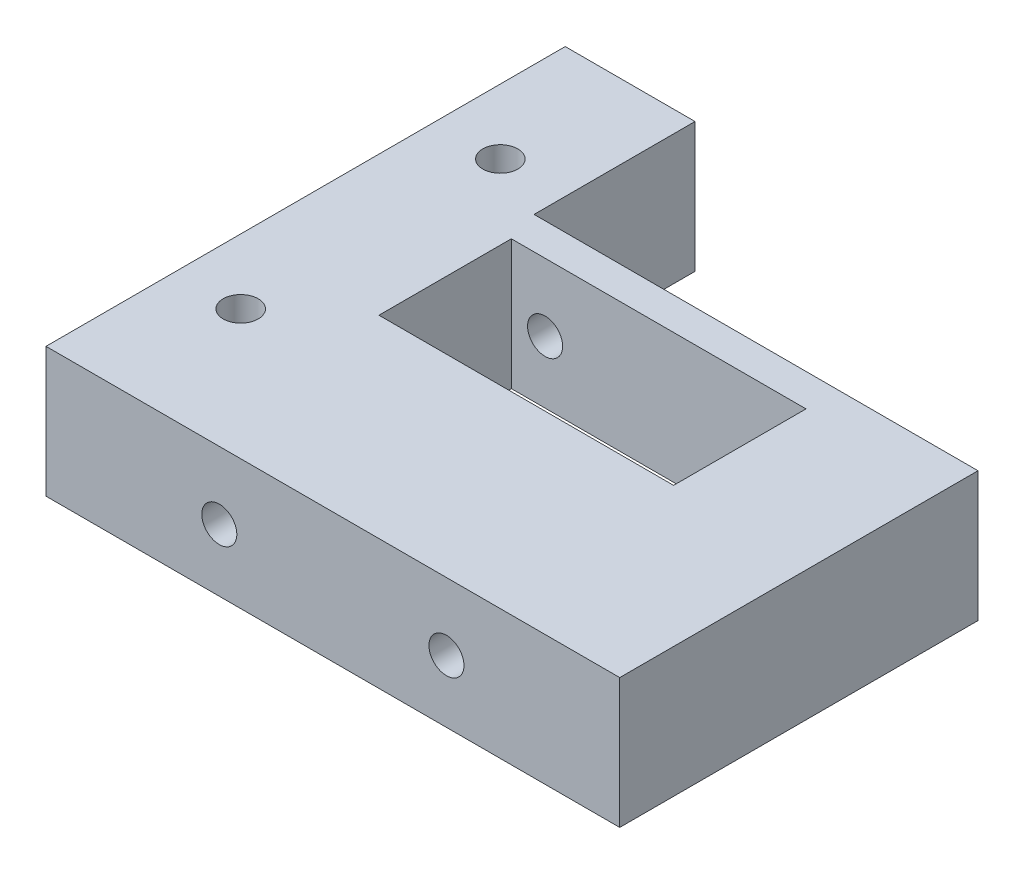
ISO-10303-21;
HEADER;
FILE_DESCRIPTION(('STEP AP214'),'2;1');
FILE_NAME('part.step','',(''),(''),'','','');
FILE_SCHEMA(('AUTOMOTIVE_DESIGN { 1 0 10303 214 1 1 1 1 }'));
ENDSEC;
DATA;
#1=APPLICATION_CONTEXT('core data for automotive mechanical design processes');
#2=APPLICATION_PROTOCOL_DEFINITION('international standard','automotive_design',2000,#1);
#3=PRODUCT_CONTEXT('',#1,'mechanical');
#4=PRODUCT('Part','Part','',(#3));
#5=PRODUCT_RELATED_PRODUCT_CATEGORY('part','',(#4));
#6=PRODUCT_DEFINITION_FORMATION('','',#4);
#7=PRODUCT_DEFINITION_CONTEXT('part definition',#1,'design');
#8=PRODUCT_DEFINITION('design','',#6,#7);
#9=PRODUCT_DEFINITION_SHAPE('','',#8);
#10=(LENGTH_UNIT() NAMED_UNIT(*) SI_UNIT(.MILLI.,.METRE.));
#11=(NAMED_UNIT(*) PLANE_ANGLE_UNIT() SI_UNIT($,.RADIAN.));
#12=(NAMED_UNIT(*) SI_UNIT($,.STERADIAN.) SOLID_ANGLE_UNIT());
#13=UNCERTAINTY_MEASURE_WITH_UNIT(LENGTH_MEASURE(1.E-05),#10,'distance_accuracy_value','');
#14=(GEOMETRIC_REPRESENTATION_CONTEXT(3) GLOBAL_UNCERTAINTY_ASSIGNED_CONTEXT((#13)) GLOBAL_UNIT_ASSIGNED_CONTEXT((#10,
#11,#12)) REPRESENTATION_CONTEXT('',''));
#15=CARTESIAN_POINT('',(0.,0.,0.));
#16=DIRECTION('',(0.,0.,1.));
#17=DIRECTION('',(1.,0.,0.));
#18=AXIS2_PLACEMENT_3D('',#15,#16,#17);
#19=CARTESIAN_POINT('',(0.,25.4,0.));
#20=DIRECTION('',(0.,-1.,0.));
#21=DIRECTION('',(0.,0.,-1.));
#22=AXIS2_PLACEMENT_3D('',#19,#20,#21);
#23=PLANE('',#22);
#24=CARTESIAN_POINT('',(-43.434,25.4,-25.4));
#25=DIRECTION('',(0.,1.,0.));
#26=DIRECTION('',(0.,0.,1.));
#27=AXIS2_PLACEMENT_3D('',#24,#25,#26);
#28=CIRCLE('',#27,3.429);
#29=CARTESIAN_POINT('',(-43.434,25.4,-21.971));
#30=VERTEX_POINT('',#29);
#31=EDGE_CURVE('E411',#30,#30,#28,.T.);
#32=ORIENTED_EDGE('',*,*,#31,.F.);
#33=EDGE_LOOP('',(#32));
#34=FACE_BOUND('',#33,.T.);
#35=CARTESIAN_POINT('',(-43.434,25.4,25.4));
#36=DIRECTION('',(0.,1.,0.));
#37=DIRECTION('',(0.,0.,1.));
#38=AXIS2_PLACEMENT_3D('',#35,#36,#37);
#39=CIRCLE('',#38,3.429);
#40=CARTESIAN_POINT('',(-43.434,25.4,28.829));
#41=VERTEX_POINT('',#40);
#42=EDGE_CURVE('E401',#41,#41,#39,.T.);
#43=ORIENTED_EDGE('',*,*,#42,.F.);
#44=EDGE_LOOP('',(#43));
#45=FACE_BOUND('',#44,.T.);
#46=DIRECTION('',(0.,0.,1.));
#47=VECTOR('',#46,1.);
#48=CARTESIAN_POINT('',(-28.829,25.4,-12.954));
#49=LINE('',#48,#47);
#50=CARTESIAN_POINT('',(-28.829,25.4,-12.954));
#51=VERTEX_POINT('',#50);
#52=CARTESIAN_POINT('',(-28.829,25.4,12.954));
#53=VERTEX_POINT('',#52);
#54=EDGE_CURVE('E138',#51,#53,#49,.T.);
#55=ORIENTED_EDGE('',*,*,#54,.F.);
#56=DIRECTION('',(-1.,0.,0.));
#57=VECTOR('',#56,1.);
#58=CARTESIAN_POINT('',(28.829,25.4,-12.954));
#59=LINE('',#58,#57);
#60=CARTESIAN_POINT('',(28.829,25.4,-12.954));
#61=VERTEX_POINT('',#60);
#62=EDGE_CURVE('E145',#61,#51,#59,.T.);
#63=ORIENTED_EDGE('',*,*,#62,.F.);
#64=DIRECTION('',(0.,0.,-1.));
#65=VECTOR('',#64,1.);
#66=CARTESIAN_POINT('',(28.829,25.4,-12.954));
#67=LINE('',#66,#65);
#68=CARTESIAN_POINT('',(28.829,25.4,12.954));
#69=VERTEX_POINT('',#68);
#70=EDGE_CURVE('E143',#69,#61,#67,.T.);
#71=ORIENTED_EDGE('',*,*,#70,.F.);
#72=DIRECTION('',(1.,0.,0.));
#73=VECTOR('',#72,1.);
#74=CARTESIAN_POINT('',(28.829,25.4,12.954));
#75=LINE('',#74,#73);
#76=EDGE_CURVE('E140',#53,#69,#75,.T.);
#77=ORIENTED_EDGE('',*,*,#76,.F.);
#78=EDGE_LOOP('',(#55,#63,#71,#77));
#79=FACE_BOUND('',#78,.T.);
#80=DIRECTION('',(0.,0.,1.));
#81=VECTOR('',#80,1.);
#82=CARTESIAN_POINT('',(-30.734,25.4,-50.8));
#83=LINE('',#82,#81);
#84=CARTESIAN_POINT('',(-30.734,25.4,-50.8));
#85=VERTEX_POINT('',#84);
#86=CARTESIAN_POINT('',(-30.734,25.4,-19.304));
#87=VERTEX_POINT('',#86);
#88=EDGE_CURVE('E109',#85,#87,#83,.T.);
#89=ORIENTED_EDGE('',*,*,#88,.F.);
#90=DIRECTION('',(-1.,0.,0.));
#91=VECTOR('',#90,1.);
#92=CARTESIAN_POINT('',(56.134,25.4,-50.8));
#93=LINE('',#92,#91);
#94=CARTESIAN_POINT('',(-56.134,25.4,-50.8));
#95=VERTEX_POINT('',#94);
#96=EDGE_CURVE('E174',#85,#95,#93,.T.);
#97=ORIENTED_EDGE('',*,*,#96,.T.);
#98=DIRECTION('',(0.,0.,1.));
#99=VECTOR('',#98,1.);
#100=CARTESIAN_POINT('',(-56.134,25.4,-50.8));
#101=LINE('',#100,#99);
#102=CARTESIAN_POINT('',(-56.134,25.4,50.8));
#103=VERTEX_POINT('',#102);
#104=EDGE_CURVE('E167',#95,#103,#101,.T.);
#105=ORIENTED_EDGE('',*,*,#104,.T.);
#106=DIRECTION('',(1.,0.,0.));
#107=VECTOR('',#106,1.);
#108=CARTESIAN_POINT('',(56.134,25.4,50.8));
#109=LINE('',#108,#107);
#110=CARTESIAN_POINT('',(56.134,25.4,50.8));
#111=VERTEX_POINT('',#110);
#112=EDGE_CURVE('E170',#103,#111,#109,.T.);
#113=ORIENTED_EDGE('',*,*,#112,.T.);
#114=DIRECTION('',(0.,0.,-1.));
#115=VECTOR('',#114,1.);
#116=CARTESIAN_POINT('',(56.134,25.4,-50.8));
#117=LINE('',#116,#115);
#118=CARTESIAN_POINT('',(56.134,25.4,-19.304));
#119=VERTEX_POINT('',#118);
#120=EDGE_CURVE('E129',#111,#119,#117,.T.);
#121=ORIENTED_EDGE('',*,*,#120,.T.);
#122=DIRECTION('',(1.,0.,0.));
#123=VECTOR('',#122,1.);
#124=CARTESIAN_POINT('',(-30.734,25.4,-19.304));
#125=LINE('',#124,#123);
#126=EDGE_CURVE('E117',#87,#119,#125,.T.);
#127=ORIENTED_EDGE('',*,*,#126,.F.);
#128=EDGE_LOOP('',(#89,#97,#105,#113,#121,#127));
#129=FACE_BOUND('',#128,.T.);
#130=ADVANCED_FACE('F33',(#34,#45,#79,#129),#23,.F.);
#131=CARTESIAN_POINT('',(0.,0.,0.));
#132=DIRECTION('',(0.,-1.,0.));
#133=DIRECTION('',(0.,0.,-1.));
#134=AXIS2_PLACEMENT_3D('',#131,#132,#133);
#135=PLANE('',#134);
#136=CARTESIAN_POINT('',(-43.434,0.,-25.4));
#137=DIRECTION('',(0.,1.,0.));
#138=DIRECTION('',(0.,0.,1.));
#139=AXIS2_PLACEMENT_3D('',#136,#137,#138);
#140=CIRCLE('',#139,3.429);
#141=CARTESIAN_POINT('',(-43.434,0.,-21.971));
#142=VERTEX_POINT('',#141);
#143=EDGE_CURVE('E407',#142,#142,#140,.T.);
#144=ORIENTED_EDGE('',*,*,#143,.T.);
#145=EDGE_LOOP('',(#144));
#146=FACE_BOUND('',#145,.T.);
#147=CARTESIAN_POINT('',(-43.434,0.,25.4));
#148=DIRECTION('',(0.,1.,0.));
#149=DIRECTION('',(0.,0.,1.));
#150=AXIS2_PLACEMENT_3D('',#147,#148,#149);
#151=CIRCLE('',#150,3.429);
#152=CARTESIAN_POINT('',(-43.434,0.,28.829));
#153=VERTEX_POINT('',#152);
#154=EDGE_CURVE('E414',#153,#153,#151,.T.);
#155=ORIENTED_EDGE('',*,*,#154,.T.);
#156=EDGE_LOOP('',(#155));
#157=FACE_BOUND('',#156,.T.);
#158=DIRECTION('',(-1.,0.,0.));
#159=VECTOR('',#158,1.);
#160=CARTESIAN_POINT('',(28.829,0.,-12.954));
#161=LINE('',#160,#159);
#162=CARTESIAN_POINT('',(28.829,0.,-12.954));
#163=VERTEX_POINT('',#162);
#164=CARTESIAN_POINT('',(-28.829,0.,-12.954));
#165=VERTEX_POINT('',#164);
#166=EDGE_CURVE('E141',#163,#165,#161,.T.);
#167=ORIENTED_EDGE('',*,*,#166,.T.);
#168=DIRECTION('',(0.,0.,1.));
#169=VECTOR('',#168,1.);
#170=CARTESIAN_POINT('',(-28.829,0.,-12.954));
#171=LINE('',#170,#169);
#172=CARTESIAN_POINT('',(-28.829,0.,12.954));
#173=VERTEX_POINT('',#172);
#174=EDGE_CURVE('E124',#165,#173,#171,.T.);
#175=ORIENTED_EDGE('',*,*,#174,.T.);
#176=DIRECTION('',(1.,0.,0.));
#177=VECTOR('',#176,1.);
#178=CARTESIAN_POINT('',(28.829,0.,12.954));
#179=LINE('',#178,#177);
#180=CARTESIAN_POINT('',(28.829,0.,12.954));
#181=VERTEX_POINT('',#180);
#182=EDGE_CURVE('E150',#173,#181,#179,.T.);
#183=ORIENTED_EDGE('',*,*,#182,.T.);
#184=DIRECTION('',(0.,0.,-1.));
#185=VECTOR('',#184,1.);
#186=CARTESIAN_POINT('',(28.829,0.,-12.954));
#187=LINE('',#186,#185);
#188=EDGE_CURVE('E153',#181,#163,#187,.T.);
#189=ORIENTED_EDGE('',*,*,#188,.T.);
#190=EDGE_LOOP('',(#167,#175,#183,#189));
#191=FACE_BOUND('',#190,.T.);
#192=DIRECTION('',(-1.,0.,0.));
#193=VECTOR('',#192,1.);
#194=CARTESIAN_POINT('',(56.134,0.,-50.8));
#195=LINE('',#194,#193);
#196=CARTESIAN_POINT('',(-30.734,0.,-50.8));
#197=VERTEX_POINT('',#196);
#198=CARTESIAN_POINT('',(-56.134,0.,-50.8));
#199=VERTEX_POINT('',#198);
#200=EDGE_CURVE('E171',#197,#199,#195,.T.);
#201=ORIENTED_EDGE('',*,*,#200,.F.);
#202=DIRECTION('',(0.,0.,1.));
#203=VECTOR('',#202,1.);
#204=CARTESIAN_POINT('',(-30.734,0.,-50.8));
#205=LINE('',#204,#203);
#206=CARTESIAN_POINT('',(-30.734,0.,-19.304));
#207=VERTEX_POINT('',#206);
#208=EDGE_CURVE('E48',#197,#207,#205,.T.);
#209=ORIENTED_EDGE('',*,*,#208,.T.);
#210=DIRECTION('',(1.,0.,0.));
#211=VECTOR('',#210,1.);
#212=CARTESIAN_POINT('',(-30.734,0.,-19.304));
#213=LINE('',#212,#211);
#214=CARTESIAN_POINT('',(56.134,0.,-19.304));
#215=VERTEX_POINT('',#214);
#216=EDGE_CURVE('E118',#207,#215,#213,.T.);
#217=ORIENTED_EDGE('',*,*,#216,.T.);
#218=DIRECTION('',(0.,0.,-1.));
#219=VECTOR('',#218,1.);
#220=CARTESIAN_POINT('',(56.134,0.,-50.8));
#221=LINE('',#220,#219);
#222=CARTESIAN_POINT('',(56.134,0.,50.8));
#223=VERTEX_POINT('',#222);
#224=EDGE_CURVE('E181',#223,#215,#221,.T.);
#225=ORIENTED_EDGE('',*,*,#224,.F.);
#226=DIRECTION('',(1.,0.,0.));
#227=VECTOR('',#226,1.);
#228=CARTESIAN_POINT('',(56.134,0.,50.8));
#229=LINE('',#228,#227);
#230=CARTESIAN_POINT('',(-56.134,0.,50.8));
#231=VERTEX_POINT('',#230);
#232=EDGE_CURVE('E179',#231,#223,#229,.T.);
#233=ORIENTED_EDGE('',*,*,#232,.F.);
#234=DIRECTION('',(0.,0.,1.));
#235=VECTOR('',#234,1.);
#236=CARTESIAN_POINT('',(-56.134,0.,-50.8));
#237=LINE('',#236,#235);
#238=EDGE_CURVE('E166',#199,#231,#237,.T.);
#239=ORIENTED_EDGE('',*,*,#238,.F.);
#240=EDGE_LOOP('',(#201,#209,#217,#225,#233,#239));
#241=FACE_BOUND('',#240,.T.);
#242=ADVANCED_FACE('F194',(#146,#157,#191,#241),#135,.T.);
#243=CARTESIAN_POINT('',(56.134,25.4,-50.8));
#244=DIRECTION('',(-1.,0.,0.));
#245=DIRECTION('',(0.,0.,1.));
#246=AXIS2_PLACEMENT_3D('',#243,#244,#245);
#247=PLANE('',#246);
#248=DIRECTION('',(0.,-1.,0.));
#249=VECTOR('',#248,1.);
#250=CARTESIAN_POINT('',(56.134,25.4,-19.304));
#251=LINE('',#250,#249);
#252=EDGE_CURVE('E125',#119,#215,#251,.T.);
#253=ORIENTED_EDGE('',*,*,#252,.F.);
#254=ORIENTED_EDGE('',*,*,#120,.F.);
#255=DIRECTION('',(0.,-1.,0.));
#256=VECTOR('',#255,1.);
#257=CARTESIAN_POINT('',(56.134,25.4,50.8));
#258=LINE('',#257,#256);
#259=EDGE_CURVE('E41',#111,#223,#258,.T.);
#260=ORIENTED_EDGE('',*,*,#259,.T.);
#261=ORIENTED_EDGE('',*,*,#224,.T.);
#262=EDGE_LOOP('',(#253,#254,#260,#261));
#263=FACE_BOUND('',#262,.T.);
#264=ADVANCED_FACE('F190',(#263),#247,.F.);
#265=CARTESIAN_POINT('',(56.134,25.4,-50.8));
#266=DIRECTION('',(0.,0.,1.));
#267=DIRECTION('',(1.,0.,0.));
#268=AXIS2_PLACEMENT_3D('',#265,#266,#267);
#269=PLANE('',#268);
#270=DIRECTION('',(0.,-1.,0.));
#271=VECTOR('',#270,1.);
#272=CARTESIAN_POINT('',(-30.734,25.4,-50.8));
#273=LINE('',#272,#271);
#274=EDGE_CURVE('E113',#85,#197,#273,.T.);
#275=ORIENTED_EDGE('',*,*,#274,.T.);
#276=ORIENTED_EDGE('',*,*,#200,.T.);
#277=DIRECTION('',(0.,-1.,0.));
#278=VECTOR('',#277,1.);
#279=CARTESIAN_POINT('',(-56.134,25.4,-50.8));
#280=LINE('',#279,#278);
#281=EDGE_CURVE('E176',#95,#199,#280,.T.);
#282=ORIENTED_EDGE('',*,*,#281,.F.);
#283=ORIENTED_EDGE('',*,*,#96,.F.);
#284=EDGE_LOOP('',(#275,#276,#282,#283));
#285=FACE_BOUND('',#284,.T.);
#286=ADVANCED_FACE('F198',(#285),#269,.F.);
#287=CARTESIAN_POINT('',(-56.134,25.4,-50.8));
#288=DIRECTION('',(1.,0.,0.));
#289=DIRECTION('',(0.,0.,-1.));
#290=AXIS2_PLACEMENT_3D('',#287,#288,#289);
#291=PLANE('',#290);
#292=ORIENTED_EDGE('',*,*,#238,.T.);
#293=DIRECTION('',(0.,-1.,0.));
#294=VECTOR('',#293,1.);
#295=CARTESIAN_POINT('',(-56.134,25.4,50.8));
#296=LINE('',#295,#294);
#297=EDGE_CURVE('E11',#103,#231,#296,.T.);
#298=ORIENTED_EDGE('',*,*,#297,.F.);
#299=ORIENTED_EDGE('',*,*,#104,.F.);
#300=ORIENTED_EDGE('',*,*,#281,.T.);
#301=EDGE_LOOP('',(#292,#298,#299,#300));
#302=FACE_BOUND('',#301,.T.);
#303=ADVANCED_FACE('F35',(#302),#291,.F.);
#304=CARTESIAN_POINT('',(56.134,25.4,50.8));
#305=DIRECTION('',(0.,0.,-1.));
#306=DIRECTION('',(-1.,0.,0.));
#307=AXIS2_PLACEMENT_3D('',#304,#305,#306);
#308=PLANE('',#307);
#309=CARTESIAN_POINT('',(22.225,12.1901619113721,50.8));
#310=DIRECTION('',(0.,0.,-1.));
#311=DIRECTION('',(-1.,0.,0.));
#312=AXIS2_PLACEMENT_3D('',#309,#310,#311);
#313=CIRCLE('',#312,3.429);
#314=CARTESIAN_POINT('',(18.796,12.1901619113721,50.8));
#315=VERTEX_POINT('',#314);
#316=EDGE_CURVE('E390',#315,#315,#313,.T.);
#317=ORIENTED_EDGE('',*,*,#316,.T.);
#318=EDGE_LOOP('',(#317));
#319=FACE_BOUND('',#318,.T.);
#320=CARTESIAN_POINT('',(-22.225,12.1901619113721,50.8));
#321=DIRECTION('',(0.,0.,-1.));
#322=DIRECTION('',(-1.,0.,0.));
#323=AXIS2_PLACEMENT_3D('',#320,#321,#322);
#324=CIRCLE('',#323,3.429);
#325=CARTESIAN_POINT('',(-25.654,12.1901619113721,50.8));
#326=VERTEX_POINT('',#325);
#327=EDGE_CURVE('E398',#326,#326,#324,.T.);
#328=ORIENTED_EDGE('',*,*,#327,.T.);
#329=EDGE_LOOP('',(#328));
#330=FACE_BOUND('',#329,.T.);
#331=ORIENTED_EDGE('',*,*,#232,.T.);
#332=ORIENTED_EDGE('',*,*,#259,.F.);
#333=ORIENTED_EDGE('',*,*,#112,.F.);
#334=ORIENTED_EDGE('',*,*,#297,.T.);
#335=EDGE_LOOP('',(#331,#332,#333,#334));
#336=FACE_BOUND('',#335,.T.);
#337=ADVANCED_FACE('F202',(#319,#330,#336),#308,.F.);
#338=CARTESIAN_POINT('',(-28.829,25.4,-12.954));
#339=DIRECTION('',(1.,0.,0.));
#340=DIRECTION('',(0.,0.,-1.));
#341=AXIS2_PLACEMENT_3D('',#338,#339,#340);
#342=PLANE('',#341);
#343=ORIENTED_EDGE('',*,*,#174,.F.);
#344=DIRECTION('',(0.,-1.,0.));
#345=VECTOR('',#344,1.);
#346=CARTESIAN_POINT('',(-28.829,25.4,-12.954));
#347=LINE('',#346,#345);
#348=EDGE_CURVE('E147',#51,#165,#347,.T.);
#349=ORIENTED_EDGE('',*,*,#348,.F.);
#350=ORIENTED_EDGE('',*,*,#54,.T.);
#351=DIRECTION('',(0.,-1.,0.));
#352=VECTOR('',#351,1.);
#353=CARTESIAN_POINT('',(-28.829,25.4,12.954));
#354=LINE('',#353,#352);
#355=EDGE_CURVE('E163',#53,#173,#354,.T.);
#356=ORIENTED_EDGE('',*,*,#355,.T.);
#357=EDGE_LOOP('',(#343,#349,#350,#356));
#358=FACE_BOUND('',#357,.T.);
#359=ADVANCED_FACE('F204',(#358),#342,.T.);
#360=CARTESIAN_POINT('',(28.829,25.4,12.954));
#361=DIRECTION('',(0.,0.,-1.));
#362=DIRECTION('',(-1.,0.,0.));
#363=AXIS2_PLACEMENT_3D('',#360,#361,#362);
#364=PLANE('',#363);
#365=CARTESIAN_POINT('',(22.225,12.1901619113721,12.954));
#366=DIRECTION('',(0.,0.,-1.));
#367=DIRECTION('',(-1.,0.,0.));
#368=AXIS2_PLACEMENT_3D('',#365,#366,#367);
#369=CIRCLE('',#368,3.429);
#370=CARTESIAN_POINT('',(18.796,12.1901619113721,12.954));
#371=VERTEX_POINT('',#370);
#372=EDGE_CURVE('E135',#371,#371,#369,.T.);
#373=ORIENTED_EDGE('',*,*,#372,.F.);
#374=EDGE_LOOP('',(#373));
#375=FACE_BOUND('',#374,.T.);
#376=CARTESIAN_POINT('',(-22.225,12.1901619113721,12.954));
#377=DIRECTION('',(0.,0.,-1.));
#378=DIRECTION('',(-1.,0.,0.));
#379=AXIS2_PLACEMENT_3D('',#376,#377,#378);
#380=CIRCLE('',#379,3.429);
#381=CARTESIAN_POINT('',(-25.654,12.1901619113721,12.954));
#382=VERTEX_POINT('',#381);
#383=EDGE_CURVE('E373',#382,#382,#380,.T.);
#384=ORIENTED_EDGE('',*,*,#383,.F.);
#385=EDGE_LOOP('',(#384));
#386=FACE_BOUND('',#385,.T.);
#387=ORIENTED_EDGE('',*,*,#182,.F.);
#388=ORIENTED_EDGE('',*,*,#355,.F.);
#389=ORIENTED_EDGE('',*,*,#76,.T.);
#390=DIRECTION('',(0.,-1.,0.));
#391=VECTOR('',#390,1.);
#392=CARTESIAN_POINT('',(28.829,25.4,12.954));
#393=LINE('',#392,#391);
#394=EDGE_CURVE('E161',#69,#181,#393,.T.);
#395=ORIENTED_EDGE('',*,*,#394,.T.);
#396=EDGE_LOOP('',(#387,#388,#389,#395));
#397=FACE_BOUND('',#396,.T.);
#398=ADVANCED_FACE('F210',(#375,#386,#397),#364,.T.);
#399=CARTESIAN_POINT('',(28.829,25.4,-12.954));
#400=DIRECTION('',(-1.,0.,0.));
#401=DIRECTION('',(0.,0.,1.));
#402=AXIS2_PLACEMENT_3D('',#399,#400,#401);
#403=PLANE('',#402);
#404=ORIENTED_EDGE('',*,*,#188,.F.);
#405=ORIENTED_EDGE('',*,*,#394,.F.);
#406=ORIENTED_EDGE('',*,*,#70,.T.);
#407=DIRECTION('',(0.,-1.,0.));
#408=VECTOR('',#407,1.);
#409=CARTESIAN_POINT('',(28.829,25.4,-12.954));
#410=LINE('',#409,#408);
#411=EDGE_CURVE('E56',#61,#163,#410,.T.);
#412=ORIENTED_EDGE('',*,*,#411,.T.);
#413=EDGE_LOOP('',(#404,#405,#406,#412));
#414=FACE_BOUND('',#413,.T.);
#415=ADVANCED_FACE('F257',(#414),#403,.T.);
#416=CARTESIAN_POINT('',(28.829,25.4,-12.954));
#417=DIRECTION('',(0.,0.,1.));
#418=DIRECTION('',(1.,0.,0.));
#419=AXIS2_PLACEMENT_3D('',#416,#417,#418);
#420=PLANE('',#419);
#421=CARTESIAN_POINT('',(22.225,12.1901619113721,-12.954));
#422=DIRECTION('',(0.,0.,1.));
#423=DIRECTION('',(1.,0.,0.));
#424=AXIS2_PLACEMENT_3D('',#421,#422,#423);
#425=CIRCLE('',#424,3.429);
#426=CARTESIAN_POINT('',(25.654,12.1901619113721,-12.954));
#427=VERTEX_POINT('',#426);
#428=EDGE_CURVE('E384',#427,#427,#425,.T.);
#429=ORIENTED_EDGE('',*,*,#428,.F.);
#430=EDGE_LOOP('',(#429));
#431=FACE_BOUND('',#430,.T.);
#432=CARTESIAN_POINT('',(-22.225,12.1901619113721,-12.954));
#433=DIRECTION('',(0.,0.,1.));
#434=DIRECTION('',(1.,0.,0.));
#435=AXIS2_PLACEMENT_3D('',#432,#433,#434);
#436=CIRCLE('',#435,3.429);
#437=CARTESIAN_POINT('',(-18.796,12.1901619113721,-12.954));
#438=VERTEX_POINT('',#437);
#439=EDGE_CURVE('E385',#438,#438,#436,.T.);
#440=ORIENTED_EDGE('',*,*,#439,.F.);
#441=EDGE_LOOP('',(#440));
#442=FACE_BOUND('',#441,.T.);
#443=ORIENTED_EDGE('',*,*,#166,.F.);
#444=ORIENTED_EDGE('',*,*,#411,.F.);
#445=ORIENTED_EDGE('',*,*,#62,.T.);
#446=ORIENTED_EDGE('',*,*,#348,.T.);
#447=EDGE_LOOP('',(#443,#444,#445,#446));
#448=FACE_BOUND('',#447,.T.);
#449=ADVANCED_FACE('F261',(#431,#442,#448),#420,.T.);
#450=CARTESIAN_POINT('',(-30.734,25.4,-50.8));
#451=DIRECTION('',(1.,0.,0.));
#452=DIRECTION('',(0.,0.,-1.));
#453=AXIS2_PLACEMENT_3D('',#450,#451,#452);
#454=PLANE('',#453);
#455=ORIENTED_EDGE('',*,*,#208,.F.);
#456=ORIENTED_EDGE('',*,*,#274,.F.);
#457=ORIENTED_EDGE('',*,*,#88,.T.);
#458=DIRECTION('',(0.,-1.,0.));
#459=VECTOR('',#458,1.);
#460=CARTESIAN_POINT('',(-30.734,25.4,-19.304));
#461=LINE('',#460,#459);
#462=EDGE_CURVE('E112',#87,#207,#461,.T.);
#463=ORIENTED_EDGE('',*,*,#462,.T.);
#464=EDGE_LOOP('',(#455,#456,#457,#463));
#465=FACE_BOUND('',#464,.T.);
#466=ADVANCED_FACE('F111',(#465),#454,.T.);
#467=CARTESIAN_POINT('',(-30.734,25.4,-19.304));
#468=DIRECTION('',(0.,0.,-1.));
#469=DIRECTION('',(-1.,0.,0.));
#470=AXIS2_PLACEMENT_3D('',#467,#468,#469);
#471=PLANE('',#470);
#472=CARTESIAN_POINT('',(22.225,12.1901619113721,-19.304));
#473=DIRECTION('',(0.,0.,-1.));
#474=DIRECTION('',(-1.,0.,0.));
#475=AXIS2_PLACEMENT_3D('',#472,#473,#474);
#476=CIRCLE('',#475,3.429);
#477=CARTESIAN_POINT('',(18.796,12.1901619113721,-19.304));
#478=VERTEX_POINT('',#477);
#479=EDGE_CURVE('E395',#478,#478,#476,.T.);
#480=ORIENTED_EDGE('',*,*,#479,.F.);
#481=EDGE_LOOP('',(#480));
#482=FACE_BOUND('',#481,.T.);
#483=CARTESIAN_POINT('',(-22.225,12.1901619113721,-19.304));
#484=DIRECTION('',(0.,0.,-1.));
#485=DIRECTION('',(-1.,0.,0.));
#486=AXIS2_PLACEMENT_3D('',#483,#484,#485);
#487=CIRCLE('',#486,3.429);
#488=CARTESIAN_POINT('',(-25.654,12.1901619113721,-19.304));
#489=VERTEX_POINT('',#488);
#490=EDGE_CURVE('E405',#489,#489,#487,.T.);
#491=ORIENTED_EDGE('',*,*,#490,.F.);
#492=EDGE_LOOP('',(#491));
#493=FACE_BOUND('',#492,.T.);
#494=ORIENTED_EDGE('',*,*,#216,.F.);
#495=ORIENTED_EDGE('',*,*,#462,.F.);
#496=ORIENTED_EDGE('',*,*,#126,.T.);
#497=ORIENTED_EDGE('',*,*,#252,.T.);
#498=EDGE_LOOP('',(#494,#495,#496,#497));
#499=FACE_BOUND('',#498,.T.);
#500=ADVANCED_FACE('F121',(#482,#493,#499),#471,.T.);
#501=CARTESIAN_POINT('',(-22.225,12.1901619113721,50.8));
#502=DIRECTION('',(0.,0.,-1.));
#503=DIRECTION('',(-1.,0.,0.));
#504=AXIS2_PLACEMENT_3D('',#501,#502,#503);
#505=CYLINDRICAL_SURFACE('',#504,3.429);
#506=ORIENTED_EDGE('',*,*,#439,.T.);
#507=EDGE_LOOP('',(#506));
#508=FACE_BOUND('',#507,.T.);
#509=ORIENTED_EDGE('',*,*,#490,.T.);
#510=EDGE_LOOP('',(#509));
#511=FACE_BOUND('',#510,.T.);
#512=ADVANCED_FACE('F285',(#508,#511),#505,.F.);
#513=CARTESIAN_POINT('',(22.225,12.1901619113721,50.8));
#514=DIRECTION('',(0.,0.,-1.));
#515=DIRECTION('',(-1.,0.,0.));
#516=AXIS2_PLACEMENT_3D('',#513,#514,#515);
#517=CYLINDRICAL_SURFACE('',#516,3.429);
#518=ORIENTED_EDGE('',*,*,#428,.T.);
#519=EDGE_LOOP('',(#518));
#520=FACE_BOUND('',#519,.T.);
#521=ORIENTED_EDGE('',*,*,#479,.T.);
#522=EDGE_LOOP('',(#521));
#523=FACE_BOUND('',#522,.T.);
#524=ADVANCED_FACE('F293',(#520,#523),#517,.F.);
#525=ORIENTED_EDGE('',*,*,#383,.T.);
#526=EDGE_LOOP('',(#525));
#527=FACE_BOUND('',#526,.T.);
#528=ORIENTED_EDGE('',*,*,#327,.F.);
#529=EDGE_LOOP('',(#528));
#530=FACE_BOUND('',#529,.T.);
#531=ADVANCED_FACE('F296',(#527,#530),#505,.F.);
#532=ORIENTED_EDGE('',*,*,#372,.T.);
#533=EDGE_LOOP('',(#532));
#534=FACE_BOUND('',#533,.T.);
#535=ORIENTED_EDGE('',*,*,#316,.F.);
#536=EDGE_LOOP('',(#535));
#537=FACE_BOUND('',#536,.T.);
#538=ADVANCED_FACE('F304',(#534,#537),#517,.F.);
#539=CARTESIAN_POINT('',(-43.434,0.,25.4));
#540=DIRECTION('',(0.,1.,0.));
#541=DIRECTION('',(0.,0.,1.));
#542=AXIS2_PLACEMENT_3D('',#539,#540,#541);
#543=CYLINDRICAL_SURFACE('',#542,3.429);
#544=ORIENTED_EDGE('',*,*,#154,.F.);
#545=EDGE_LOOP('',(#544));
#546=FACE_BOUND('',#545,.T.);
#547=ORIENTED_EDGE('',*,*,#42,.T.);
#548=EDGE_LOOP('',(#547));
#549=FACE_BOUND('',#548,.T.);
#550=ADVANCED_FACE('F316',(#546,#549),#543,.F.);
#551=CARTESIAN_POINT('',(-43.434,0.,-25.4));
#552=DIRECTION('',(0.,1.,0.));
#553=DIRECTION('',(0.,0.,1.));
#554=AXIS2_PLACEMENT_3D('',#551,#552,#553);
#555=CYLINDRICAL_SURFACE('',#554,3.429);
#556=ORIENTED_EDGE('',*,*,#143,.F.);
#557=EDGE_LOOP('',(#556));
#558=FACE_BOUND('',#557,.T.);
#559=ORIENTED_EDGE('',*,*,#31,.T.);
#560=EDGE_LOOP('',(#559));
#561=FACE_BOUND('',#560,.T.);
#562=ADVANCED_FACE('F323',(#558,#561),#555,.F.);
#563=CLOSED_SHELL('',(#130,#242,#264,#286,#303,#337,#359,#398,#415,#449,#466,#500,#512,#524,
#531,#538,#550,#562));
#564=MANIFOLD_SOLID_BREP('B2',#563);
#565=ADVANCED_BREP_SHAPE_REPRESENTATION('',(#18,#564),#14);
#566=SHAPE_DEFINITION_REPRESENTATION(#9,#565);
ENDSEC;
END-ISO-10303-21;
